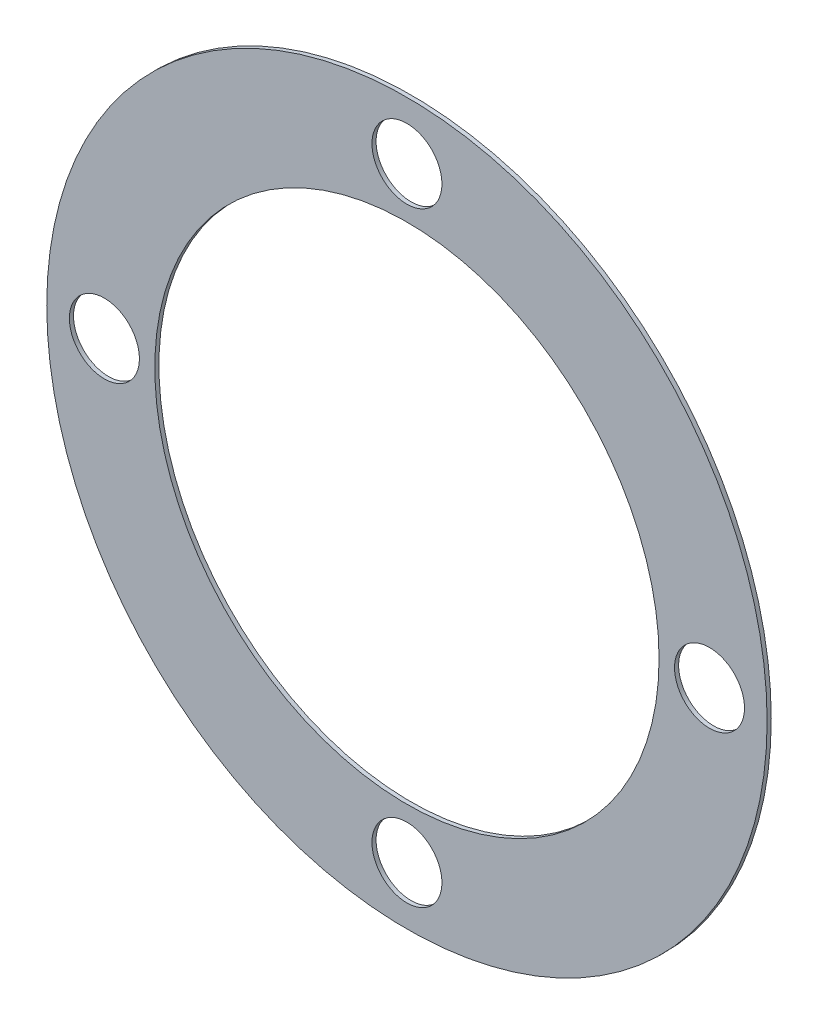
ISO-10303-21;
HEADER;
FILE_DESCRIPTION(('STEP AP214'),'2;1');
FILE_NAME('part.step','',(''),(''),'','','');
FILE_SCHEMA(('AUTOMOTIVE_DESIGN { 1 0 10303 214 1 1 1 1 }'));
ENDSEC;
DATA;
#1=APPLICATION_CONTEXT('core data for automotive mechanical design processes');
#2=APPLICATION_PROTOCOL_DEFINITION('international standard','automotive_design',2000,#1);
#3=PRODUCT_CONTEXT('',#1,'mechanical');
#4=PRODUCT('Part','Part','',(#3));
#5=PRODUCT_RELATED_PRODUCT_CATEGORY('part','',(#4));
#6=PRODUCT_DEFINITION_FORMATION('','',#4);
#7=PRODUCT_DEFINITION_CONTEXT('part definition',#1,'design');
#8=PRODUCT_DEFINITION('design','',#6,#7);
#9=PRODUCT_DEFINITION_SHAPE('','',#8);
#10=(LENGTH_UNIT() NAMED_UNIT(*) SI_UNIT(.MILLI.,.METRE.));
#11=(NAMED_UNIT(*) PLANE_ANGLE_UNIT() SI_UNIT($,.RADIAN.));
#12=(NAMED_UNIT(*) SI_UNIT($,.STERADIAN.) SOLID_ANGLE_UNIT());
#13=UNCERTAINTY_MEASURE_WITH_UNIT(LENGTH_MEASURE(1.E-05),#10,'distance_accuracy_value','');
#14=(GEOMETRIC_REPRESENTATION_CONTEXT(3) GLOBAL_UNCERTAINTY_ASSIGNED_CONTEXT((#13)) GLOBAL_UNIT_ASSIGNED_CONTEXT((#10,
#11,#12)) REPRESENTATION_CONTEXT('',''));
#15=CARTESIAN_POINT('',(0.,0.,0.));
#16=DIRECTION('',(0.,0.,1.));
#17=DIRECTION('',(1.,0.,0.));
#18=AXIS2_PLACEMENT_3D('',#15,#16,#17);
#19=CARTESIAN_POINT('',(0.,0.,1.));
#20=DIRECTION('',(0.,0.,1.));
#21=DIRECTION('',(1.,0.,0.));
#22=AXIS2_PLACEMENT_3D('',#19,#20,#21);
#23=PLANE('',#22);
#24=CARTESIAN_POINT('',(0.,-73.5,1.));
#25=DIRECTION('',(0.,0.,1.));
#26=DIRECTION('',(-1.,0.,0.));
#27=AXIS2_PLACEMENT_3D('',#24,#25,#26);
#28=CIRCLE('',#27,8.5);
#29=CARTESIAN_POINT('',(-8.5,-73.5,1.));
#30=VERTEX_POINT('',#29);
#31=EDGE_CURVE('E86',#30,#30,#28,.T.);
#32=ORIENTED_EDGE('',*,*,#31,.F.);
#33=EDGE_LOOP('',(#32));
#34=FACE_BOUND('',#33,.T.);
#35=CARTESIAN_POINT('',(73.5,0.,1.));
#36=DIRECTION('',(0.,0.,1.));
#37=DIRECTION('',(1.,0.,0.));
#38=AXIS2_PLACEMENT_3D('',#35,#36,#37);
#39=CIRCLE('',#38,8.50000000000001);
#40=CARTESIAN_POINT('',(82.,0.,1.));
#41=VERTEX_POINT('',#40);
#42=EDGE_CURVE('E70',#41,#41,#39,.T.);
#43=ORIENTED_EDGE('',*,*,#42,.F.);
#44=EDGE_LOOP('',(#43));
#45=FACE_BOUND('',#44,.T.);
#46=CARTESIAN_POINT('',(0.,0.,1.));
#47=DIRECTION('',(0.,0.,1.));
#48=DIRECTION('',(1.,0.,0.));
#49=AXIS2_PLACEMENT_3D('',#46,#47,#48);
#50=CIRCLE('',#49,87.5);
#51=CARTESIAN_POINT('',(87.5,0.,1.));
#52=VERTEX_POINT('',#51);
#53=EDGE_CURVE('E12',#52,#52,#50,.T.);
#54=ORIENTED_EDGE('',*,*,#53,.T.);
#55=EDGE_LOOP('',(#54));
#56=FACE_BOUND('',#55,.T.);
#57=CARTESIAN_POINT('',(0.,73.5,1.));
#58=DIRECTION('',(0.,0.,1.));
#59=DIRECTION('',(1.,0.,0.));
#60=AXIS2_PLACEMENT_3D('',#57,#58,#59);
#61=CIRCLE('',#60,8.5);
#62=CARTESIAN_POINT('',(8.5,73.5,1.));
#63=VERTEX_POINT('',#62);
#64=EDGE_CURVE('E64',#63,#63,#61,.T.);
#65=ORIENTED_EDGE('',*,*,#64,.F.);
#66=EDGE_LOOP('',(#65));
#67=FACE_BOUND('',#66,.T.);
#68=CARTESIAN_POINT('',(-73.5,0.,1.));
#69=DIRECTION('',(0.,0.,1.));
#70=DIRECTION('',(-1.,0.,0.));
#71=AXIS2_PLACEMENT_3D('',#68,#69,#70);
#72=CIRCLE('',#71,8.50000000000001);
#73=CARTESIAN_POINT('',(-82.,0.,1.));
#74=VERTEX_POINT('',#73);
#75=EDGE_CURVE('E78',#74,#74,#72,.T.);
#76=ORIENTED_EDGE('',*,*,#75,.F.);
#77=EDGE_LOOP('',(#76));
#78=FACE_BOUND('',#77,.T.);
#79=CARTESIAN_POINT('',(0.,0.,1.));
#80=DIRECTION('',(0.,0.,1.));
#81=DIRECTION('',(1.,0.,0.));
#82=AXIS2_PLACEMENT_3D('',#79,#80,#81);
#83=CIRCLE('',#82,61.25);
#84=CARTESIAN_POINT('',(61.25,0.,1.));
#85=VERTEX_POINT('',#84);
#86=EDGE_CURVE('E94',#85,#85,#83,.T.);
#87=ORIENTED_EDGE('',*,*,#86,.F.);
#88=EDGE_LOOP('',(#87));
#89=FACE_BOUND('',#88,.T.);
#90=ADVANCED_FACE('F50',(#34,#45,#56,#67,#78,#89),#23,.T.);
#91=CARTESIAN_POINT('',(0.,0.,0.));
#92=DIRECTION('',(0.,0.,1.));
#93=DIRECTION('',(1.,0.,0.));
#94=AXIS2_PLACEMENT_3D('',#91,#92,#93);
#95=PLANE('',#94);
#96=CARTESIAN_POINT('',(0.,0.,0.));
#97=DIRECTION('',(0.,0.,1.));
#98=DIRECTION('',(1.,0.,0.));
#99=AXIS2_PLACEMENT_3D('',#96,#97,#98);
#100=CIRCLE('',#99,87.5);
#101=CARTESIAN_POINT('',(87.5,0.,0.));
#102=VERTEX_POINT('',#101);
#103=EDGE_CURVE('E54',#102,#102,#100,.T.);
#104=ORIENTED_EDGE('',*,*,#103,.F.);
#105=EDGE_LOOP('',(#104));
#106=FACE_BOUND('',#105,.T.);
#107=CARTESIAN_POINT('',(0.,73.5,0.));
#108=DIRECTION('',(0.,0.,1.));
#109=DIRECTION('',(1.,0.,0.));
#110=AXIS2_PLACEMENT_3D('',#107,#108,#109);
#111=CIRCLE('',#110,8.5);
#112=CARTESIAN_POINT('',(8.5,73.5,0.));
#113=VERTEX_POINT('',#112);
#114=EDGE_CURVE('E66',#113,#113,#111,.T.);
#115=ORIENTED_EDGE('',*,*,#114,.T.);
#116=EDGE_LOOP('',(#115));
#117=FACE_BOUND('',#116,.T.);
#118=CARTESIAN_POINT('',(73.5,0.,0.));
#119=DIRECTION('',(0.,0.,1.));
#120=DIRECTION('',(1.,0.,0.));
#121=AXIS2_PLACEMENT_3D('',#118,#119,#120);
#122=CIRCLE('',#121,8.50000000000001);
#123=CARTESIAN_POINT('',(82.,0.,0.));
#124=VERTEX_POINT('',#123);
#125=EDGE_CURVE('E74',#124,#124,#122,.T.);
#126=ORIENTED_EDGE('',*,*,#125,.T.);
#127=EDGE_LOOP('',(#126));
#128=FACE_BOUND('',#127,.T.);
#129=CARTESIAN_POINT('',(-73.5,0.,0.));
#130=DIRECTION('',(0.,0.,1.));
#131=DIRECTION('',(-1.,0.,0.));
#132=AXIS2_PLACEMENT_3D('',#129,#130,#131);
#133=CIRCLE('',#132,8.50000000000001);
#134=CARTESIAN_POINT('',(-82.,0.,0.));
#135=VERTEX_POINT('',#134);
#136=EDGE_CURVE('E82',#135,#135,#133,.T.);
#137=ORIENTED_EDGE('',*,*,#136,.T.);
#138=EDGE_LOOP('',(#137));
#139=FACE_BOUND('',#138,.T.);
#140=CARTESIAN_POINT('',(0.,-73.5,0.));
#141=DIRECTION('',(0.,0.,1.));
#142=DIRECTION('',(-1.,0.,0.));
#143=AXIS2_PLACEMENT_3D('',#140,#141,#142);
#144=CIRCLE('',#143,8.5);
#145=CARTESIAN_POINT('',(-8.5,-73.5,0.));
#146=VERTEX_POINT('',#145);
#147=EDGE_CURVE('E90',#146,#146,#144,.T.);
#148=ORIENTED_EDGE('',*,*,#147,.T.);
#149=EDGE_LOOP('',(#148));
#150=FACE_BOUND('',#149,.T.);
#151=CARTESIAN_POINT('',(0.,0.,0.));
#152=DIRECTION('',(0.,0.,1.));
#153=DIRECTION('',(1.,0.,0.));
#154=AXIS2_PLACEMENT_3D('',#151,#152,#153);
#155=CIRCLE('',#154,61.25);
#156=CARTESIAN_POINT('',(61.25,0.,0.));
#157=VERTEX_POINT('',#156);
#158=EDGE_CURVE('E98',#157,#157,#155,.T.);
#159=ORIENTED_EDGE('',*,*,#158,.T.);
#160=EDGE_LOOP('',(#159));
#161=FACE_BOUND('',#160,.T.);
#162=ADVANCED_FACE('F111',(#106,#117,#128,#139,#150,#161),#95,.F.);
#163=CARTESIAN_POINT('',(0.,0.,1.));
#164=DIRECTION('',(0.,0.,-1.));
#165=DIRECTION('',(-1.,0.,0.));
#166=AXIS2_PLACEMENT_3D('',#163,#164,#165);
#167=CYLINDRICAL_SURFACE('',#166,87.5);
#168=ORIENTED_EDGE('',*,*,#53,.F.);
#169=EDGE_LOOP('',(#168));
#170=FACE_BOUND('',#169,.T.);
#171=ORIENTED_EDGE('',*,*,#103,.T.);
#172=EDGE_LOOP('',(#171));
#173=FACE_BOUND('',#172,.T.);
#174=ADVANCED_FACE('F52',(#170,#173),#167,.T.);
#175=CARTESIAN_POINT('',(0.,73.5,1.));
#176=DIRECTION('',(0.,0.,-1.));
#177=DIRECTION('',(-1.,0.,0.));
#178=AXIS2_PLACEMENT_3D('',#175,#176,#177);
#179=CYLINDRICAL_SURFACE('',#178,8.5);
#180=ORIENTED_EDGE('',*,*,#64,.T.);
#181=EDGE_LOOP('',(#180));
#182=FACE_BOUND('',#181,.T.);
#183=ORIENTED_EDGE('',*,*,#114,.F.);
#184=EDGE_LOOP('',(#183));
#185=FACE_BOUND('',#184,.T.);
#186=ADVANCED_FACE('F121',(#182,#185),#179,.F.);
#187=CARTESIAN_POINT('',(73.5,0.,1.));
#188=DIRECTION('',(0.,0.,-1.));
#189=DIRECTION('',(-1.,0.,0.));
#190=AXIS2_PLACEMENT_3D('',#187,#188,#189);
#191=CYLINDRICAL_SURFACE('',#190,8.50000000000001);
#192=ORIENTED_EDGE('',*,*,#42,.T.);
#193=EDGE_LOOP('',(#192));
#194=FACE_BOUND('',#193,.T.);
#195=ORIENTED_EDGE('',*,*,#125,.F.);
#196=EDGE_LOOP('',(#195));
#197=FACE_BOUND('',#196,.T.);
#198=ADVANCED_FACE('F124',(#194,#197),#191,.F.);
#199=CARTESIAN_POINT('',(-73.5,0.,1.));
#200=DIRECTION('',(0.,0.,-1.));
#201=DIRECTION('',(-1.,0.,0.));
#202=AXIS2_PLACEMENT_3D('',#199,#200,#201);
#203=CYLINDRICAL_SURFACE('',#202,8.50000000000001);
#204=ORIENTED_EDGE('',*,*,#75,.T.);
#205=EDGE_LOOP('',(#204));
#206=FACE_BOUND('',#205,.T.);
#207=ORIENTED_EDGE('',*,*,#136,.F.);
#208=EDGE_LOOP('',(#207));
#209=FACE_BOUND('',#208,.T.);
#210=ADVANCED_FACE('F128',(#206,#209),#203,.F.);
#211=CARTESIAN_POINT('',(0.,-73.5,1.));
#212=DIRECTION('',(0.,0.,-1.));
#213=DIRECTION('',(-1.,0.,0.));
#214=AXIS2_PLACEMENT_3D('',#211,#212,#213);
#215=CYLINDRICAL_SURFACE('',#214,8.5);
#216=ORIENTED_EDGE('',*,*,#31,.T.);
#217=EDGE_LOOP('',(#216));
#218=FACE_BOUND('',#217,.T.);
#219=ORIENTED_EDGE('',*,*,#147,.F.);
#220=EDGE_LOOP('',(#219));
#221=FACE_BOUND('',#220,.T.);
#222=ADVANCED_FACE('F132',(#218,#221),#215,.F.);
#223=CARTESIAN_POINT('',(0.,0.,1.));
#224=DIRECTION('',(0.,0.,-1.));
#225=DIRECTION('',(-1.,0.,0.));
#226=AXIS2_PLACEMENT_3D('',#223,#224,#225);
#227=CYLINDRICAL_SURFACE('',#226,61.25);
#228=ORIENTED_EDGE('',*,*,#86,.T.);
#229=EDGE_LOOP('',(#228));
#230=FACE_BOUND('',#229,.T.);
#231=ORIENTED_EDGE('',*,*,#158,.F.);
#232=EDGE_LOOP('',(#231));
#233=FACE_BOUND('',#232,.T.);
#234=ADVANCED_FACE('F107',(#230,#233),#227,.F.);
#235=CLOSED_SHELL('',(#90,#162,#174,#186,#198,#210,#222,#234));
#236=MANIFOLD_SOLID_BREP('B2',#235);
#237=ADVANCED_BREP_SHAPE_REPRESENTATION('',(#18,#236),#14);
#238=SHAPE_DEFINITION_REPRESENTATION(#9,#237);
ENDSEC;
END-ISO-10303-21;
